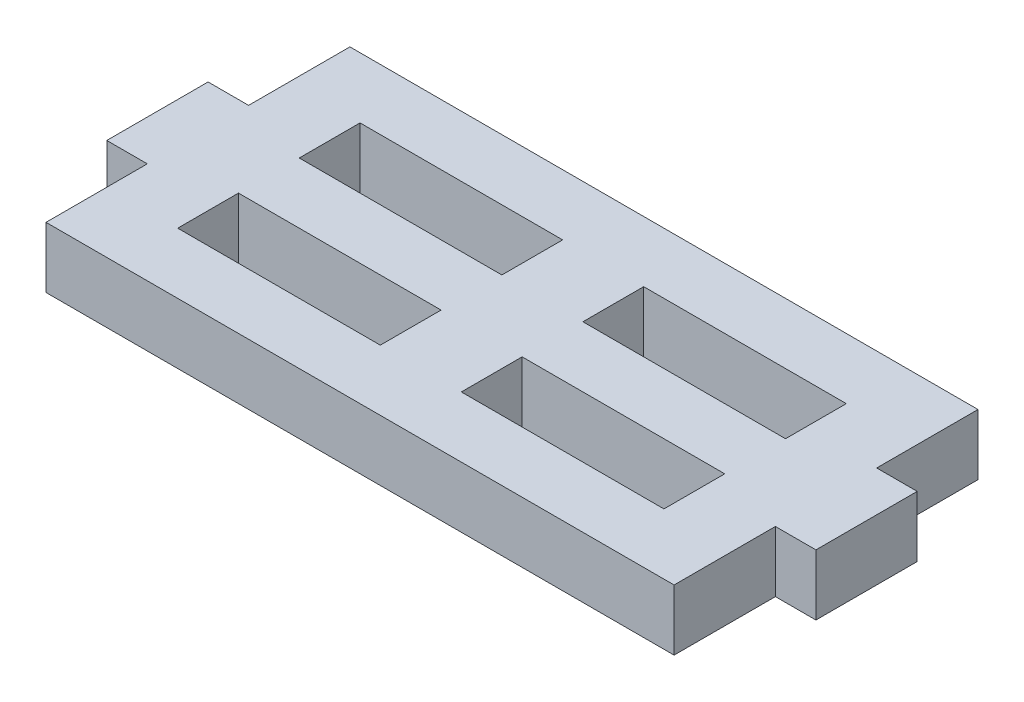
ISO-10303-21;
HEADER;
FILE_DESCRIPTION(('STEP AP214'),'2;1');
FILE_NAME('part.step','',(''),(''),'','','');
FILE_SCHEMA(('AUTOMOTIVE_DESIGN { 1 0 10303 214 1 1 1 1 }'));
ENDSEC;
DATA;
#1=APPLICATION_CONTEXT('core data for automotive mechanical design processes');
#2=APPLICATION_PROTOCOL_DEFINITION('international standard','automotive_design',2000,#1);
#3=PRODUCT_CONTEXT('',#1,'mechanical');
#4=PRODUCT('Part','Part','',(#3));
#5=PRODUCT_RELATED_PRODUCT_CATEGORY('part','',(#4));
#6=PRODUCT_DEFINITION_FORMATION('','',#4);
#7=PRODUCT_DEFINITION_CONTEXT('part definition',#1,'design');
#8=PRODUCT_DEFINITION('design','',#6,#7);
#9=PRODUCT_DEFINITION_SHAPE('','',#8);
#10=(LENGTH_UNIT() NAMED_UNIT(*) SI_UNIT(.MILLI.,.METRE.));
#11=(NAMED_UNIT(*) PLANE_ANGLE_UNIT() SI_UNIT($,.RADIAN.));
#12=(NAMED_UNIT(*) SI_UNIT($,.STERADIAN.) SOLID_ANGLE_UNIT());
#13=UNCERTAINTY_MEASURE_WITH_UNIT(LENGTH_MEASURE(1.E-05),#10,'distance_accuracy_value','');
#14=(GEOMETRIC_REPRESENTATION_CONTEXT(3) GLOBAL_UNCERTAINTY_ASSIGNED_CONTEXT((#13)) GLOBAL_UNIT_ASSIGNED_CONTEXT((#10,
#11,#12)) REPRESENTATION_CONTEXT('',''));
#15=CARTESIAN_POINT('',(0.,0.,0.));
#16=DIRECTION('',(0.,0.,1.));
#17=DIRECTION('',(1.,0.,0.));
#18=AXIS2_PLACEMENT_3D('',#15,#16,#17);
#19=CARTESIAN_POINT('',(-17.5,3.,7.5));
#20=DIRECTION('',(1.,0.,0.));
#21=DIRECTION('',(0.,0.,-1.));
#22=AXIS2_PLACEMENT_3D('',#19,#20,#21);
#23=PLANE('',#22);
#24=DIRECTION('',(0.,0.,1.));
#25=VECTOR('',#24,1.);
#26=CARTESIAN_POINT('',(-17.5,3.,7.5));
#27=LINE('',#26,#25);
#28=CARTESIAN_POINT('',(-17.5,3.,-2.5));
#29=VERTEX_POINT('',#28);
#30=CARTESIAN_POINT('',(-17.5,3.,2.5));
#31=VERTEX_POINT('',#30);
#32=EDGE_CURVE('E235',#29,#31,#27,.T.);
#33=ORIENTED_EDGE('',*,*,#32,.F.);
#34=DIRECTION('',(0.,1.,0.));
#35=VECTOR('',#34,1.);
#36=CARTESIAN_POINT('',(-17.5,0.,-2.5));
#37=LINE('',#36,#35);
#38=CARTESIAN_POINT('',(-17.5,0.,-2.5));
#39=VERTEX_POINT('',#38);
#40=EDGE_CURVE('E224',#39,#29,#37,.T.);
#41=ORIENTED_EDGE('',*,*,#40,.F.);
#42=DIRECTION('',(0.,0.,1.));
#43=VECTOR('',#42,1.);
#44=CARTESIAN_POINT('',(-17.5,0.,7.5));
#45=LINE('',#44,#43);
#46=CARTESIAN_POINT('',(-17.5,0.,2.5));
#47=VERTEX_POINT('',#46);
#48=EDGE_CURVE('E234',#39,#47,#45,.T.);
#49=ORIENTED_EDGE('',*,*,#48,.T.);
#50=DIRECTION('',(0.,1.,0.));
#51=VECTOR('',#50,1.);
#52=CARTESIAN_POINT('',(-17.5,0.,2.5));
#53=LINE('',#52,#51);
#54=EDGE_CURVE('E763',#47,#31,#53,.T.);
#55=ORIENTED_EDGE('',*,*,#54,.T.);
#56=EDGE_LOOP('',(#33,#41,#49,#55));
#57=FACE_BOUND('',#56,.T.);
#58=ADVANCED_FACE('F34',(#57),#23,.F.);
#59=CARTESIAN_POINT('',(17.5,3.,7.5));
#60=DIRECTION('',(0.,0.,-1.));
#61=DIRECTION('',(-1.,0.,0.));
#62=AXIS2_PLACEMENT_3D('',#59,#60,#61);
#63=PLANE('',#62);
#64=DIRECTION('',(1.,0.,0.));
#65=VECTOR('',#64,1.);
#66=CARTESIAN_POINT('',(17.5,3.,7.5));
#67=LINE('',#66,#65);
#68=CARTESIAN_POINT('',(-15.5,3.,7.5));
#69=VERTEX_POINT('',#68);
#70=CARTESIAN_POINT('',(15.5,3.,7.5));
#71=VERTEX_POINT('',#70);
#72=EDGE_CURVE('E257',#69,#71,#67,.T.);
#73=ORIENTED_EDGE('',*,*,#72,.F.);
#74=DIRECTION('',(0.,1.,0.));
#75=VECTOR('',#74,1.);
#76=CARTESIAN_POINT('',(-15.5,0.,7.5));
#77=LINE('',#76,#75);
#78=CARTESIAN_POINT('',(-15.5,0.,7.5));
#79=VERTEX_POINT('',#78);
#80=EDGE_CURVE('E768',#79,#69,#77,.T.);
#81=ORIENTED_EDGE('',*,*,#80,.F.);
#82=DIRECTION('',(1.,0.,0.));
#83=VECTOR('',#82,1.);
#84=CARTESIAN_POINT('',(17.5,0.,7.5));
#85=LINE('',#84,#83);
#86=CARTESIAN_POINT('',(15.5,0.,7.5));
#87=VERTEX_POINT('',#86);
#88=EDGE_CURVE('E239',#79,#87,#85,.T.);
#89=ORIENTED_EDGE('',*,*,#88,.T.);
#90=DIRECTION('',(0.,1.,0.));
#91=VECTOR('',#90,1.);
#92=CARTESIAN_POINT('',(15.5,0.,7.5));
#93=LINE('',#92,#91);
#94=EDGE_CURVE('E745',#87,#71,#93,.T.);
#95=ORIENTED_EDGE('',*,*,#94,.T.);
#96=EDGE_LOOP('',(#73,#81,#89,#95));
#97=FACE_BOUND('',#96,.T.);
#98=ADVANCED_FACE('F446',(#97),#63,.F.);
#99=CARTESIAN_POINT('',(17.5,3.,7.5));
#100=DIRECTION('',(-1.,0.,0.));
#101=DIRECTION('',(0.,0.,1.));
#102=AXIS2_PLACEMENT_3D('',#99,#100,#101);
#103=PLANE('',#102);
#104=DIRECTION('',(0.,0.,-1.));
#105=VECTOR('',#104,1.);
#106=CARTESIAN_POINT('',(17.5,3.,7.5));
#107=LINE('',#106,#105);
#108=CARTESIAN_POINT('',(17.5,3.,2.5));
#109=VERTEX_POINT('',#108);
#110=CARTESIAN_POINT('',(17.5,3.,-2.5));
#111=VERTEX_POINT('',#110);
#112=EDGE_CURVE('E42',#109,#111,#107,.T.);
#113=ORIENTED_EDGE('',*,*,#112,.F.);
#114=DIRECTION('',(0.,1.,0.));
#115=VECTOR('',#114,1.);
#116=CARTESIAN_POINT('',(17.5,0.,2.5));
#117=LINE('',#116,#115);
#118=CARTESIAN_POINT('',(17.5,0.,2.5));
#119=VERTEX_POINT('',#118);
#120=EDGE_CURVE('E754',#119,#109,#117,.T.);
#121=ORIENTED_EDGE('',*,*,#120,.F.);
#122=DIRECTION('',(0.,0.,-1.));
#123=VECTOR('',#122,1.);
#124=CARTESIAN_POINT('',(17.5,0.,7.5));
#125=LINE('',#124,#123);
#126=CARTESIAN_POINT('',(17.5,0.,-2.5));
#127=VERTEX_POINT('',#126);
#128=EDGE_CURVE('E242',#119,#127,#125,.T.);
#129=ORIENTED_EDGE('',*,*,#128,.T.);
#130=DIRECTION('',(0.,1.,0.));
#131=VECTOR('',#130,1.);
#132=CARTESIAN_POINT('',(17.5,0.,-2.5));
#133=LINE('',#132,#131);
#134=EDGE_CURVE('E281',#127,#111,#133,.T.);
#135=ORIENTED_EDGE('',*,*,#134,.T.);
#136=EDGE_LOOP('',(#113,#121,#129,#135));
#137=FACE_BOUND('',#136,.T.);
#138=ADVANCED_FACE('F288',(#137),#103,.F.);
#139=CARTESIAN_POINT('',(17.5,3.,-7.5));
#140=DIRECTION('',(0.,0.,1.));
#141=DIRECTION('',(1.,0.,0.));
#142=AXIS2_PLACEMENT_3D('',#139,#140,#141);
#143=PLANE('',#142);
#144=DIRECTION('',(-1.,0.,0.));
#145=VECTOR('',#144,1.);
#146=CARTESIAN_POINT('',(17.5,0.,-7.5));
#147=LINE('',#146,#145);
#148=CARTESIAN_POINT('',(15.5,0.,-7.5));
#149=VERTEX_POINT('',#148);
#150=CARTESIAN_POINT('',(-15.5,0.,-7.5));
#151=VERTEX_POINT('',#150);
#152=EDGE_CURVE('E37',#149,#151,#147,.T.);
#153=ORIENTED_EDGE('',*,*,#152,.T.);
#154=DIRECTION('',(0.,1.,0.));
#155=VECTOR('',#154,1.);
#156=CARTESIAN_POINT('',(-15.5,0.,-7.5));
#157=LINE('',#156,#155);
#158=CARTESIAN_POINT('',(-15.5,3.,-7.5));
#159=VERTEX_POINT('',#158);
#160=EDGE_CURVE('E739',#151,#159,#157,.T.);
#161=ORIENTED_EDGE('',*,*,#160,.T.);
#162=DIRECTION('',(-1.,0.,0.));
#163=VECTOR('',#162,1.);
#164=CARTESIAN_POINT('',(17.5,3.,-7.5));
#165=LINE('',#164,#163);
#166=CARTESIAN_POINT('',(15.5,3.,-7.5));
#167=VERTEX_POINT('',#166);
#168=EDGE_CURVE('E11',#167,#159,#165,.T.);
#169=ORIENTED_EDGE('',*,*,#168,.F.);
#170=DIRECTION('',(0.,1.,0.));
#171=VECTOR('',#170,1.);
#172=CARTESIAN_POINT('',(15.5,0.,-7.5));
#173=LINE('',#172,#171);
#174=EDGE_CURVE('E289',#149,#167,#173,.T.);
#175=ORIENTED_EDGE('',*,*,#174,.F.);
#176=EDGE_LOOP('',(#153,#161,#169,#175));
#177=FACE_BOUND('',#176,.T.);
#178=ADVANCED_FACE('F454',(#177),#143,.F.);
#179=CARTESIAN_POINT('',(0.,3.,0.));
#180=DIRECTION('',(0.,1.,0.));
#181=DIRECTION('',(0.,0.,1.));
#182=AXIS2_PLACEMENT_3D('',#179,#180,#181);
#183=PLANE('',#182);
#184=DIRECTION('',(0.,0.,-1.));
#185=VECTOR('',#184,1.);
#186=CARTESIAN_POINT('',(-15.5,3.,-2.5));
#187=LINE('',#186,#185);
#188=CARTESIAN_POINT('',(-15.5,3.,-2.5));
#189=VERTEX_POINT('',#188);
#190=EDGE_CURVE('E229',#189,#159,#187,.T.);
#191=ORIENTED_EDGE('',*,*,#190,.F.);
#192=DIRECTION('',(1.,0.,0.));
#193=VECTOR('',#192,1.);
#194=CARTESIAN_POINT('',(-17.5,3.,-2.5));
#195=LINE('',#194,#193);
#196=EDGE_CURVE('E740',#29,#189,#195,.T.);
#197=ORIENTED_EDGE('',*,*,#196,.F.);
#198=ORIENTED_EDGE('',*,*,#32,.T.);
#199=DIRECTION('',(-1.,0.,0.));
#200=VECTOR('',#199,1.);
#201=CARTESIAN_POINT('',(-17.5,3.,2.5));
#202=LINE('',#201,#200);
#203=CARTESIAN_POINT('',(-15.5,3.,2.5));
#204=VERTEX_POINT('',#203);
#205=EDGE_CURVE('E773',#204,#31,#202,.T.);
#206=ORIENTED_EDGE('',*,*,#205,.F.);
#207=DIRECTION('',(0.,0.,-1.));
#208=VECTOR('',#207,1.);
#209=CARTESIAN_POINT('',(-15.5,3.,2.5));
#210=LINE('',#209,#208);
#211=EDGE_CURVE('E743',#69,#204,#210,.T.);
#212=ORIENTED_EDGE('',*,*,#211,.F.);
#213=ORIENTED_EDGE('',*,*,#72,.T.);
#214=DIRECTION('',(0.,0.,1.));
#215=VECTOR('',#214,1.);
#216=CARTESIAN_POINT('',(15.5,3.,2.5));
#217=LINE('',#216,#215);
#218=CARTESIAN_POINT('',(15.5,3.,2.5));
#219=VERTEX_POINT('',#218);
#220=EDGE_CURVE('E758',#219,#71,#217,.T.);
#221=ORIENTED_EDGE('',*,*,#220,.F.);
#222=DIRECTION('',(-1.,0.,0.));
#223=VECTOR('',#222,1.);
#224=CARTESIAN_POINT('',(17.5,3.,2.5));
#225=LINE('',#224,#223);
#226=EDGE_CURVE('E277',#109,#219,#225,.T.);
#227=ORIENTED_EDGE('',*,*,#226,.F.);
#228=ORIENTED_EDGE('',*,*,#112,.T.);
#229=DIRECTION('',(1.,0.,0.));
#230=VECTOR('',#229,1.);
#231=CARTESIAN_POINT('',(17.5,3.,-2.5));
#232=LINE('',#231,#230);
#233=CARTESIAN_POINT('',(15.5,3.,-2.5));
#234=VERTEX_POINT('',#233);
#235=EDGE_CURVE('E274',#234,#111,#232,.T.);
#236=ORIENTED_EDGE('',*,*,#235,.F.);
#237=DIRECTION('',(0.,0.,1.));
#238=VECTOR('',#237,1.);
#239=CARTESIAN_POINT('',(15.5,3.,-2.5));
#240=LINE('',#239,#238);
#241=EDGE_CURVE('E286',#167,#234,#240,.T.);
#242=ORIENTED_EDGE('',*,*,#241,.F.);
#243=ORIENTED_EDGE('',*,*,#168,.T.);
#244=EDGE_LOOP('',(#191,#197,#198,#206,#212,#213,#221,#227,#228,#236,#242,#243));
#245=FACE_BOUND('',#244,.T.);
#246=DIRECTION('',(-1.,0.,0.));
#247=VECTOR('',#246,1.);
#248=CARTESIAN_POINT('',(12.,3.,-4.5));
#249=LINE('',#248,#247);
#250=CARTESIAN_POINT('',(12.,3.,-4.5));
#251=VERTEX_POINT('',#250);
#252=CARTESIAN_POINT('',(2.,3.,-4.5));
#253=VERTEX_POINT('',#252);
#254=EDGE_CURVE('E291',#251,#253,#249,.T.);
#255=ORIENTED_EDGE('',*,*,#254,.F.);
#256=DIRECTION('',(0.,0.,-1.));
#257=VECTOR('',#256,1.);
#258=CARTESIAN_POINT('',(12.,3.,-4.5));
#259=LINE('',#258,#257);
#260=CARTESIAN_POINT('',(12.,3.,-1.5));
#261=VERTEX_POINT('',#260);
#262=EDGE_CURVE('E300',#261,#251,#259,.T.);
#263=ORIENTED_EDGE('',*,*,#262,.F.);
#264=DIRECTION('',(1.,0.,0.));
#265=VECTOR('',#264,1.);
#266=CARTESIAN_POINT('',(12.,3.,-1.5));
#267=LINE('',#266,#265);
#268=CARTESIAN_POINT('',(2.,3.,-1.5));
#269=VERTEX_POINT('',#268);
#270=EDGE_CURVE('E314',#269,#261,#267,.T.);
#271=ORIENTED_EDGE('',*,*,#270,.F.);
#272=DIRECTION('',(0.,0.,1.));
#273=VECTOR('',#272,1.);
#274=CARTESIAN_POINT('',(2.,3.,-4.5));
#275=LINE('',#274,#273);
#276=EDGE_CURVE('E311',#253,#269,#275,.T.);
#277=ORIENTED_EDGE('',*,*,#276,.F.);
#278=EDGE_LOOP('',(#255,#263,#271,#277));
#279=FACE_BOUND('',#278,.T.);
#280=DIRECTION('',(1.,0.,0.));
#281=VECTOR('',#280,1.);
#282=CARTESIAN_POINT('',(12.,3.,4.5));
#283=LINE('',#282,#281);
#284=CARTESIAN_POINT('',(2.,3.,4.5));
#285=VERTEX_POINT('',#284);
#286=CARTESIAN_POINT('',(12.,3.,4.5));
#287=VERTEX_POINT('',#286);
#288=EDGE_CURVE('E321',#285,#287,#283,.T.);
#289=ORIENTED_EDGE('',*,*,#288,.F.);
#290=DIRECTION('',(0.,0.,1.));
#291=VECTOR('',#290,1.);
#292=CARTESIAN_POINT('',(2.,3.,4.5));
#293=LINE('',#292,#291);
#294=CARTESIAN_POINT('',(2.,3.,1.5));
#295=VERTEX_POINT('',#294);
#296=EDGE_CURVE('E332',#295,#285,#293,.T.);
#297=ORIENTED_EDGE('',*,*,#296,.F.);
#298=DIRECTION('',(-1.,0.,0.));
#299=VECTOR('',#298,1.);
#300=CARTESIAN_POINT('',(12.,3.,1.5));
#301=LINE('',#300,#299);
#302=CARTESIAN_POINT('',(12.,3.,1.5));
#303=VERTEX_POINT('',#302);
#304=EDGE_CURVE('E346',#303,#295,#301,.T.);
#305=ORIENTED_EDGE('',*,*,#304,.F.);
#306=DIRECTION('',(0.,0.,-1.));
#307=VECTOR('',#306,1.);
#308=CARTESIAN_POINT('',(12.,3.,4.5));
#309=LINE('',#308,#307);
#310=EDGE_CURVE('E343',#287,#303,#309,.T.);
#311=ORIENTED_EDGE('',*,*,#310,.F.);
#312=EDGE_LOOP('',(#289,#297,#305,#311));
#313=FACE_BOUND('',#312,.T.);
#314=DIRECTION('',(1.,0.,0.));
#315=VECTOR('',#314,1.);
#316=CARTESIAN_POINT('',(-12.,3.,4.5));
#317=LINE('',#316,#315);
#318=CARTESIAN_POINT('',(-12.,3.,4.5));
#319=VERTEX_POINT('',#318);
#320=CARTESIAN_POINT('',(-2.,3.,4.5));
#321=VERTEX_POINT('',#320);
#322=EDGE_CURVE('E353',#319,#321,#317,.T.);
#323=ORIENTED_EDGE('',*,*,#322,.F.);
#324=DIRECTION('',(0.,0.,1.));
#325=VECTOR('',#324,1.);
#326=CARTESIAN_POINT('',(-12.,3.,4.5));
#327=LINE('',#326,#325);
#328=CARTESIAN_POINT('',(-12.,3.,1.5));
#329=VERTEX_POINT('',#328);
#330=EDGE_CURVE('E364',#329,#319,#327,.T.);
#331=ORIENTED_EDGE('',*,*,#330,.F.);
#332=DIRECTION('',(-1.,0.,0.));
#333=VECTOR('',#332,1.);
#334=CARTESIAN_POINT('',(-12.,3.,1.5));
#335=LINE('',#334,#333);
#336=CARTESIAN_POINT('',(-2.,3.,1.5));
#337=VERTEX_POINT('',#336);
#338=EDGE_CURVE('E378',#337,#329,#335,.T.);
#339=ORIENTED_EDGE('',*,*,#338,.F.);
#340=DIRECTION('',(0.,0.,-1.));
#341=VECTOR('',#340,1.);
#342=CARTESIAN_POINT('',(-2.,3.,4.5));
#343=LINE('',#342,#341);
#344=EDGE_CURVE('E375',#321,#337,#343,.T.);
#345=ORIENTED_EDGE('',*,*,#344,.F.);
#346=EDGE_LOOP('',(#323,#331,#339,#345));
#347=FACE_BOUND('',#346,.T.);
#348=DIRECTION('',(0.,0.,-1.));
#349=VECTOR('',#348,1.);
#350=CARTESIAN_POINT('',(-2.,3.,-4.5));
#351=LINE('',#350,#349);
#352=CARTESIAN_POINT('',(-2.,3.,-1.5));
#353=VERTEX_POINT('',#352);
#354=CARTESIAN_POINT('',(-2.,3.,-4.5));
#355=VERTEX_POINT('',#354);
#356=EDGE_CURVE('E385',#353,#355,#351,.T.);
#357=ORIENTED_EDGE('',*,*,#356,.F.);
#358=DIRECTION('',(1.,0.,0.));
#359=VECTOR('',#358,1.);
#360=CARTESIAN_POINT('',(-12.,3.,-1.5));
#361=LINE('',#360,#359);
#362=CARTESIAN_POINT('',(-12.,3.,-1.5));
#363=VERTEX_POINT('',#362);
#364=EDGE_CURVE('E396',#363,#353,#361,.T.);
#365=ORIENTED_EDGE('',*,*,#364,.F.);
#366=DIRECTION('',(0.,0.,1.));
#367=VECTOR('',#366,1.);
#368=CARTESIAN_POINT('',(-12.,3.,-4.5));
#369=LINE('',#368,#367);
#370=CARTESIAN_POINT('',(-12.,3.,-4.5));
#371=VERTEX_POINT('',#370);
#372=EDGE_CURVE('E409',#371,#363,#369,.T.);
#373=ORIENTED_EDGE('',*,*,#372,.F.);
#374=DIRECTION('',(-1.,0.,0.));
#375=VECTOR('',#374,1.);
#376=CARTESIAN_POINT('',(-12.,3.,-4.5));
#377=LINE('',#376,#375);
#378=EDGE_CURVE('E406',#355,#371,#377,.T.);
#379=ORIENTED_EDGE('',*,*,#378,.F.);
#380=EDGE_LOOP('',(#357,#365,#373,#379));
#381=FACE_BOUND('',#380,.T.);
#382=ADVANCED_FACE('F271',(#245,#279,#313,#347,#381),#183,.T.);
#383=CARTESIAN_POINT('',(0.,0.,0.));
#384=DIRECTION('',(0.,1.,0.));
#385=DIRECTION('',(0.,0.,1.));
#386=AXIS2_PLACEMENT_3D('',#383,#384,#385);
#387=PLANE('',#386);
#388=DIRECTION('',(0.,0.,-1.));
#389=VECTOR('',#388,1.);
#390=CARTESIAN_POINT('',(12.,0.,-4.5));
#391=LINE('',#390,#389);
#392=CARTESIAN_POINT('',(12.,0.,-1.5));
#393=VERTEX_POINT('',#392);
#394=CARTESIAN_POINT('',(12.,0.,-4.5));
#395=VERTEX_POINT('',#394);
#396=EDGE_CURVE('E306',#393,#395,#391,.T.);
#397=ORIENTED_EDGE('',*,*,#396,.T.);
#398=DIRECTION('',(-1.,0.,0.));
#399=VECTOR('',#398,1.);
#400=CARTESIAN_POINT('',(12.,0.,-4.5));
#401=LINE('',#400,#399);
#402=CARTESIAN_POINT('',(2.,0.,-4.5));
#403=VERTEX_POINT('',#402);
#404=EDGE_CURVE('E296',#395,#403,#401,.T.);
#405=ORIENTED_EDGE('',*,*,#404,.T.);
#406=DIRECTION('',(0.,0.,1.));
#407=VECTOR('',#406,1.);
#408=CARTESIAN_POINT('',(2.,0.,-4.5));
#409=LINE('',#408,#407);
#410=CARTESIAN_POINT('',(2.,0.,-1.5));
#411=VERTEX_POINT('',#410);
#412=EDGE_CURVE('E299',#403,#411,#409,.T.);
#413=ORIENTED_EDGE('',*,*,#412,.T.);
#414=DIRECTION('',(1.,0.,0.));
#415=VECTOR('',#414,1.);
#416=CARTESIAN_POINT('',(12.,0.,-1.5));
#417=LINE('',#416,#415);
#418=EDGE_CURVE('E303',#411,#393,#417,.T.);
#419=ORIENTED_EDGE('',*,*,#418,.T.);
#420=EDGE_LOOP('',(#397,#405,#413,#419));
#421=FACE_BOUND('',#420,.T.);
#422=DIRECTION('',(0.,0.,1.));
#423=VECTOR('',#422,1.);
#424=CARTESIAN_POINT('',(2.,0.,4.5));
#425=LINE('',#424,#423);
#426=CARTESIAN_POINT('',(2.,0.,1.5));
#427=VERTEX_POINT('',#426);
#428=CARTESIAN_POINT('',(2.,0.,4.5));
#429=VERTEX_POINT('',#428);
#430=EDGE_CURVE('E338',#427,#429,#425,.T.);
#431=ORIENTED_EDGE('',*,*,#430,.T.);
#432=DIRECTION('',(1.,0.,0.));
#433=VECTOR('',#432,1.);
#434=CARTESIAN_POINT('',(12.,0.,4.5));
#435=LINE('',#434,#433);
#436=CARTESIAN_POINT('',(12.,0.,4.5));
#437=VERTEX_POINT('',#436);
#438=EDGE_CURVE('E328',#429,#437,#435,.T.);
#439=ORIENTED_EDGE('',*,*,#438,.T.);
#440=DIRECTION('',(0.,0.,-1.));
#441=VECTOR('',#440,1.);
#442=CARTESIAN_POINT('',(12.,0.,4.5));
#443=LINE('',#442,#441);
#444=CARTESIAN_POINT('',(12.,0.,1.5));
#445=VERTEX_POINT('',#444);
#446=EDGE_CURVE('E331',#437,#445,#443,.T.);
#447=ORIENTED_EDGE('',*,*,#446,.T.);
#448=DIRECTION('',(-1.,0.,0.));
#449=VECTOR('',#448,1.);
#450=CARTESIAN_POINT('',(12.,0.,1.5));
#451=LINE('',#450,#449);
#452=EDGE_CURVE('E335',#445,#427,#451,.T.);
#453=ORIENTED_EDGE('',*,*,#452,.T.);
#454=EDGE_LOOP('',(#431,#439,#447,#453));
#455=FACE_BOUND('',#454,.T.);
#456=DIRECTION('',(0.,0.,1.));
#457=VECTOR('',#456,1.);
#458=CARTESIAN_POINT('',(-12.,0.,4.5));
#459=LINE('',#458,#457);
#460=CARTESIAN_POINT('',(-12.,0.,1.5));
#461=VERTEX_POINT('',#460);
#462=CARTESIAN_POINT('',(-12.,0.,4.5));
#463=VERTEX_POINT('',#462);
#464=EDGE_CURVE('E370',#461,#463,#459,.T.);
#465=ORIENTED_EDGE('',*,*,#464,.T.);
#466=DIRECTION('',(1.,0.,0.));
#467=VECTOR('',#466,1.);
#468=CARTESIAN_POINT('',(-12.,0.,4.5));
#469=LINE('',#468,#467);
#470=CARTESIAN_POINT('',(-2.,0.,4.5));
#471=VERTEX_POINT('',#470);
#472=EDGE_CURVE('E360',#463,#471,#469,.T.);
#473=ORIENTED_EDGE('',*,*,#472,.T.);
#474=DIRECTION('',(0.,0.,-1.));
#475=VECTOR('',#474,1.);
#476=CARTESIAN_POINT('',(-2.,0.,4.5));
#477=LINE('',#476,#475);
#478=CARTESIAN_POINT('',(-2.,0.,1.5));
#479=VERTEX_POINT('',#478);
#480=EDGE_CURVE('E363',#471,#479,#477,.T.);
#481=ORIENTED_EDGE('',*,*,#480,.T.);
#482=DIRECTION('',(-1.,0.,0.));
#483=VECTOR('',#482,1.);
#484=CARTESIAN_POINT('',(-12.,0.,1.5));
#485=LINE('',#484,#483);
#486=EDGE_CURVE('E367',#479,#461,#485,.T.);
#487=ORIENTED_EDGE('',*,*,#486,.T.);
#488=EDGE_LOOP('',(#465,#473,#481,#487));
#489=FACE_BOUND('',#488,.T.);
#490=DIRECTION('',(1.,0.,0.));
#491=VECTOR('',#490,1.);
#492=CARTESIAN_POINT('',(-12.,0.,-1.5));
#493=LINE('',#492,#491);
#494=CARTESIAN_POINT('',(-12.,0.,-1.5));
#495=VERTEX_POINT('',#494);
#496=CARTESIAN_POINT('',(-2.,0.,-1.5));
#497=VERTEX_POINT('',#496);
#498=EDGE_CURVE('E402',#495,#497,#493,.T.);
#499=ORIENTED_EDGE('',*,*,#498,.T.);
#500=DIRECTION('',(0.,0.,-1.));
#501=VECTOR('',#500,1.);
#502=CARTESIAN_POINT('',(-2.,0.,-4.5));
#503=LINE('',#502,#501);
#504=CARTESIAN_POINT('',(-2.,0.,-4.5));
#505=VERTEX_POINT('',#504);
#506=EDGE_CURVE('E392',#497,#505,#503,.T.);
#507=ORIENTED_EDGE('',*,*,#506,.T.);
#508=DIRECTION('',(-1.,0.,0.));
#509=VECTOR('',#508,1.);
#510=CARTESIAN_POINT('',(-12.,0.,-4.5));
#511=LINE('',#510,#509);
#512=CARTESIAN_POINT('',(-12.,0.,-4.5));
#513=VERTEX_POINT('',#512);
#514=EDGE_CURVE('E395',#505,#513,#511,.T.);
#515=ORIENTED_EDGE('',*,*,#514,.T.);
#516=DIRECTION('',(0.,0.,1.));
#517=VECTOR('',#516,1.);
#518=CARTESIAN_POINT('',(-12.,0.,-4.5));
#519=LINE('',#518,#517);
#520=EDGE_CURVE('E399',#513,#495,#519,.T.);
#521=ORIENTED_EDGE('',*,*,#520,.T.);
#522=EDGE_LOOP('',(#499,#507,#515,#521));
#523=FACE_BOUND('',#522,.T.);
#524=DIRECTION('',(1.,0.,0.));
#525=VECTOR('',#524,1.);
#526=CARTESIAN_POINT('',(-17.5,0.,-2.5));
#527=LINE('',#526,#525);
#528=CARTESIAN_POINT('',(-15.5,0.,-2.5));
#529=VERTEX_POINT('',#528);
#530=EDGE_CURVE('E220',#39,#529,#527,.T.);
#531=ORIENTED_EDGE('',*,*,#530,.T.);
#532=DIRECTION('',(0.,0.,-1.));
#533=VECTOR('',#532,1.);
#534=CARTESIAN_POINT('',(-15.5,0.,-2.5));
#535=LINE('',#534,#533);
#536=EDGE_CURVE('E50',#529,#151,#535,.T.);
#537=ORIENTED_EDGE('',*,*,#536,.T.);
#538=ORIENTED_EDGE('',*,*,#152,.F.);
#539=DIRECTION('',(0.,0.,1.));
#540=VECTOR('',#539,1.);
#541=CARTESIAN_POINT('',(15.5,0.,-2.5));
#542=LINE('',#541,#540);
#543=CARTESIAN_POINT('',(15.5,0.,-2.5));
#544=VERTEX_POINT('',#543);
#545=EDGE_CURVE('E285',#149,#544,#542,.T.);
#546=ORIENTED_EDGE('',*,*,#545,.T.);
#547=DIRECTION('',(1.,0.,0.));
#548=VECTOR('',#547,1.);
#549=CARTESIAN_POINT('',(17.5,0.,-2.5));
#550=LINE('',#549,#548);
#551=EDGE_CURVE('E293',#544,#127,#550,.T.);
#552=ORIENTED_EDGE('',*,*,#551,.T.);
#553=ORIENTED_EDGE('',*,*,#128,.F.);
#554=DIRECTION('',(-1.,0.,0.));
#555=VECTOR('',#554,1.);
#556=CARTESIAN_POINT('',(17.5,0.,2.5));
#557=LINE('',#556,#555);
#558=CARTESIAN_POINT('',(15.5,0.,2.5));
#559=VERTEX_POINT('',#558);
#560=EDGE_CURVE('E761',#119,#559,#557,.T.);
#561=ORIENTED_EDGE('',*,*,#560,.T.);
#562=DIRECTION('',(0.,0.,1.));
#563=VECTOR('',#562,1.);
#564=CARTESIAN_POINT('',(15.5,0.,2.5));
#565=LINE('',#564,#563);
#566=EDGE_CURVE('E756',#559,#87,#565,.T.);
#567=ORIENTED_EDGE('',*,*,#566,.T.);
#568=ORIENTED_EDGE('',*,*,#88,.F.);
#569=DIRECTION('',(0.,0.,-1.));
#570=VECTOR('',#569,1.);
#571=CARTESIAN_POINT('',(-15.5,0.,2.5));
#572=LINE('',#571,#570);
#573=CARTESIAN_POINT('',(-15.5,0.,2.5));
#574=VERTEX_POINT('',#573);
#575=EDGE_CURVE('E775',#79,#574,#572,.T.);
#576=ORIENTED_EDGE('',*,*,#575,.T.);
#577=DIRECTION('',(-1.,0.,0.));
#578=VECTOR('',#577,1.);
#579=CARTESIAN_POINT('',(-17.5,0.,2.5));
#580=LINE('',#579,#578);
#581=EDGE_CURVE('E58',#574,#47,#580,.T.);
#582=ORIENTED_EDGE('',*,*,#581,.T.);
#583=ORIENTED_EDGE('',*,*,#48,.F.);
#584=EDGE_LOOP('',(#531,#537,#538,#546,#552,#553,#561,#567,#568,#576,#582,#583));
#585=FACE_BOUND('',#584,.T.);
#586=ADVANCED_FACE('F237',(#421,#455,#489,#523,#585),#387,.F.);
#587=CARTESIAN_POINT('',(-2.,0.,-4.5));
#588=DIRECTION('',(1.,0.,0.));
#589=DIRECTION('',(0.,0.,-1.));
#590=AXIS2_PLACEMENT_3D('',#587,#588,#589);
#591=PLANE('',#590);
#592=ORIENTED_EDGE('',*,*,#356,.T.);
#593=DIRECTION('',(0.,1.,0.));
#594=VECTOR('',#593,1.);
#595=CARTESIAN_POINT('',(-2.,0.,-4.5));
#596=LINE('',#595,#594);
#597=EDGE_CURVE('E264',#505,#355,#596,.T.);
#598=ORIENTED_EDGE('',*,*,#597,.F.);
#599=ORIENTED_EDGE('',*,*,#506,.F.);
#600=DIRECTION('',(0.,1.,0.));
#601=VECTOR('',#600,1.);
#602=CARTESIAN_POINT('',(-2.,0.,-1.5));
#603=LINE('',#602,#601);
#604=EDGE_CURVE('E240',#497,#353,#603,.T.);
#605=ORIENTED_EDGE('',*,*,#604,.T.);
#606=EDGE_LOOP('',(#592,#598,#599,#605));
#607=FACE_BOUND('',#606,.T.);
#608=ADVANCED_FACE('F433',(#607),#591,.F.);
#609=CARTESIAN_POINT('',(-12.,0.,-1.5));
#610=DIRECTION('',(0.,0.,1.));
#611=DIRECTION('',(1.,0.,0.));
#612=AXIS2_PLACEMENT_3D('',#609,#610,#611);
#613=PLANE('',#612);
#614=ORIENTED_EDGE('',*,*,#364,.T.);
#615=ORIENTED_EDGE('',*,*,#604,.F.);
#616=ORIENTED_EDGE('',*,*,#498,.F.);
#617=DIRECTION('',(0.,1.,0.));
#618=VECTOR('',#617,1.);
#619=CARTESIAN_POINT('',(-12.,0.,-1.5));
#620=LINE('',#619,#618);
#621=EDGE_CURVE('E244',#495,#363,#620,.T.);
#622=ORIENTED_EDGE('',*,*,#621,.T.);
#623=EDGE_LOOP('',(#614,#615,#616,#622));
#624=FACE_BOUND('',#623,.T.);
#625=ADVANCED_FACE('F431',(#624),#613,.F.);
#626=CARTESIAN_POINT('',(-12.,0.,-4.5));
#627=DIRECTION('',(-1.,0.,0.));
#628=DIRECTION('',(0.,0.,1.));
#629=AXIS2_PLACEMENT_3D('',#626,#627,#628);
#630=PLANE('',#629);
#631=ORIENTED_EDGE('',*,*,#372,.T.);
#632=ORIENTED_EDGE('',*,*,#621,.F.);
#633=ORIENTED_EDGE('',*,*,#520,.F.);
#634=DIRECTION('',(0.,1.,0.));
#635=VECTOR('',#634,1.);
#636=CARTESIAN_POINT('',(-12.,0.,-4.5));
#637=LINE('',#636,#635);
#638=EDGE_CURVE('E414',#513,#371,#637,.T.);
#639=ORIENTED_EDGE('',*,*,#638,.T.);
#640=EDGE_LOOP('',(#631,#632,#633,#639));
#641=FACE_BOUND('',#640,.T.);
#642=ADVANCED_FACE('F428',(#641),#630,.F.);
#643=CARTESIAN_POINT('',(-12.,0.,-4.5));
#644=DIRECTION('',(0.,0.,-1.));
#645=DIRECTION('',(-1.,0.,0.));
#646=AXIS2_PLACEMENT_3D('',#643,#644,#645);
#647=PLANE('',#646);
#648=ORIENTED_EDGE('',*,*,#378,.T.);
#649=ORIENTED_EDGE('',*,*,#638,.F.);
#650=ORIENTED_EDGE('',*,*,#514,.F.);
#651=ORIENTED_EDGE('',*,*,#597,.T.);
#652=EDGE_LOOP('',(#648,#649,#650,#651));
#653=FACE_BOUND('',#652,.T.);
#654=ADVANCED_FACE('F421',(#653),#647,.F.);
#655=CARTESIAN_POINT('',(-12.,0.,4.5));
#656=DIRECTION('',(0.,0.,1.));
#657=DIRECTION('',(1.,0.,0.));
#658=AXIS2_PLACEMENT_3D('',#655,#656,#657);
#659=PLANE('',#658);
#660=ORIENTED_EDGE('',*,*,#322,.T.);
#661=DIRECTION('',(0.,1.,0.));
#662=VECTOR('',#661,1.);
#663=CARTESIAN_POINT('',(-2.,0.,4.5));
#664=LINE('',#663,#662);
#665=EDGE_CURVE('E373',#471,#321,#664,.T.);
#666=ORIENTED_EDGE('',*,*,#665,.F.);
#667=ORIENTED_EDGE('',*,*,#472,.F.);
#668=DIRECTION('',(0.,1.,0.));
#669=VECTOR('',#668,1.);
#670=CARTESIAN_POINT('',(-12.,0.,4.5));
#671=LINE('',#670,#669);
#672=EDGE_CURVE('E383',#463,#319,#671,.T.);
#673=ORIENTED_EDGE('',*,*,#672,.T.);
#674=EDGE_LOOP('',(#660,#666,#667,#673));
#675=FACE_BOUND('',#674,.T.);
#676=ADVANCED_FACE('F586',(#675),#659,.F.);
#677=CARTESIAN_POINT('',(-12.,0.,4.5));
#678=DIRECTION('',(-1.,0.,0.));
#679=DIRECTION('',(0.,0.,1.));
#680=AXIS2_PLACEMENT_3D('',#677,#678,#679);
#681=PLANE('',#680);
#682=ORIENTED_EDGE('',*,*,#330,.T.);
#683=ORIENTED_EDGE('',*,*,#672,.F.);
#684=ORIENTED_EDGE('',*,*,#464,.F.);
#685=DIRECTION('',(0.,1.,0.));
#686=VECTOR('',#685,1.);
#687=CARTESIAN_POINT('',(-12.,0.,1.5));
#688=LINE('',#687,#686);
#689=EDGE_CURVE('E386',#461,#329,#688,.T.);
#690=ORIENTED_EDGE('',*,*,#689,.T.);
#691=EDGE_LOOP('',(#682,#683,#684,#690));
#692=FACE_BOUND('',#691,.T.);
#693=ADVANCED_FACE('F582',(#692),#681,.F.);
#694=CARTESIAN_POINT('',(-12.,0.,1.5));
#695=DIRECTION('',(0.,0.,-1.));
#696=DIRECTION('',(-1.,0.,0.));
#697=AXIS2_PLACEMENT_3D('',#694,#695,#696);
#698=PLANE('',#697);
#699=ORIENTED_EDGE('',*,*,#338,.T.);
#700=ORIENTED_EDGE('',*,*,#689,.F.);
#701=ORIENTED_EDGE('',*,*,#486,.F.);
#702=DIRECTION('',(0.,1.,0.));
#703=VECTOR('',#702,1.);
#704=CARTESIAN_POINT('',(-2.,0.,1.5));
#705=LINE('',#704,#703);
#706=EDGE_CURVE('E388',#479,#337,#705,.T.);
#707=ORIENTED_EDGE('',*,*,#706,.T.);
#708=EDGE_LOOP('',(#699,#700,#701,#707));
#709=FACE_BOUND('',#708,.T.);
#710=ADVANCED_FACE('F585',(#709),#698,.F.);
#711=CARTESIAN_POINT('',(-2.,0.,4.5));
#712=DIRECTION('',(1.,0.,0.));
#713=DIRECTION('',(0.,0.,-1.));
#714=AXIS2_PLACEMENT_3D('',#711,#712,#713);
#715=PLANE('',#714);
#716=ORIENTED_EDGE('',*,*,#344,.T.);
#717=ORIENTED_EDGE('',*,*,#706,.F.);
#718=ORIENTED_EDGE('',*,*,#480,.F.);
#719=ORIENTED_EDGE('',*,*,#665,.T.);
#720=EDGE_LOOP('',(#716,#717,#718,#719));
#721=FACE_BOUND('',#720,.T.);
#722=ADVANCED_FACE('F580',(#721),#715,.F.);
#723=CARTESIAN_POINT('',(12.,0.,4.5));
#724=DIRECTION('',(0.,0.,1.));
#725=DIRECTION('',(1.,0.,0.));
#726=AXIS2_PLACEMENT_3D('',#723,#724,#725);
#727=PLANE('',#726);
#728=ORIENTED_EDGE('',*,*,#288,.T.);
#729=DIRECTION('',(0.,1.,0.));
#730=VECTOR('',#729,1.);
#731=CARTESIAN_POINT('',(12.,0.,4.5));
#732=LINE('',#731,#730);
#733=EDGE_CURVE('E341',#437,#287,#732,.T.);
#734=ORIENTED_EDGE('',*,*,#733,.F.);
#735=ORIENTED_EDGE('',*,*,#438,.F.);
#736=DIRECTION('',(0.,1.,0.));
#737=VECTOR('',#736,1.);
#738=CARTESIAN_POINT('',(2.,0.,4.5));
#739=LINE('',#738,#737);
#740=EDGE_CURVE('E351',#429,#285,#739,.T.);
#741=ORIENTED_EDGE('',*,*,#740,.T.);
#742=EDGE_LOOP('',(#728,#734,#735,#741));
#743=FACE_BOUND('',#742,.T.);
#744=ADVANCED_FACE('F570',(#743),#727,.F.);
#745=CARTESIAN_POINT('',(2.,0.,4.5));
#746=DIRECTION('',(-1.,0.,0.));
#747=DIRECTION('',(0.,0.,1.));
#748=AXIS2_PLACEMENT_3D('',#745,#746,#747);
#749=PLANE('',#748);
#750=ORIENTED_EDGE('',*,*,#296,.T.);
#751=ORIENTED_EDGE('',*,*,#740,.F.);
#752=ORIENTED_EDGE('',*,*,#430,.F.);
#753=DIRECTION('',(0.,1.,0.));
#754=VECTOR('',#753,1.);
#755=CARTESIAN_POINT('',(2.,0.,1.5));
#756=LINE('',#755,#754);
#757=EDGE_CURVE('E354',#427,#295,#756,.T.);
#758=ORIENTED_EDGE('',*,*,#757,.T.);
#759=EDGE_LOOP('',(#750,#751,#752,#758));
#760=FACE_BOUND('',#759,.T.);
#761=ADVANCED_FACE('F566',(#760),#749,.F.);
#762=CARTESIAN_POINT('',(12.,0.,1.5));
#763=DIRECTION('',(0.,0.,-1.));
#764=DIRECTION('',(-1.,0.,0.));
#765=AXIS2_PLACEMENT_3D('',#762,#763,#764);
#766=PLANE('',#765);
#767=ORIENTED_EDGE('',*,*,#304,.T.);
#768=ORIENTED_EDGE('',*,*,#757,.F.);
#769=ORIENTED_EDGE('',*,*,#452,.F.);
#770=DIRECTION('',(0.,1.,0.));
#771=VECTOR('',#770,1.);
#772=CARTESIAN_POINT('',(12.,0.,1.5));
#773=LINE('',#772,#771);
#774=EDGE_CURVE('E356',#445,#303,#773,.T.);
#775=ORIENTED_EDGE('',*,*,#774,.T.);
#776=EDGE_LOOP('',(#767,#768,#769,#775));
#777=FACE_BOUND('',#776,.T.);
#778=ADVANCED_FACE('F569',(#777),#766,.F.);
#779=CARTESIAN_POINT('',(12.,0.,4.5));
#780=DIRECTION('',(1.,0.,0.));
#781=DIRECTION('',(0.,0.,-1.));
#782=AXIS2_PLACEMENT_3D('',#779,#780,#781);
#783=PLANE('',#782);
#784=ORIENTED_EDGE('',*,*,#310,.T.);
#785=ORIENTED_EDGE('',*,*,#774,.F.);
#786=ORIENTED_EDGE('',*,*,#446,.F.);
#787=ORIENTED_EDGE('',*,*,#733,.T.);
#788=EDGE_LOOP('',(#784,#785,#786,#787));
#789=FACE_BOUND('',#788,.T.);
#790=ADVANCED_FACE('F564',(#789),#783,.F.);
#791=CARTESIAN_POINT('',(12.,0.,-4.5));
#792=DIRECTION('',(0.,0.,-1.));
#793=DIRECTION('',(-1.,0.,0.));
#794=AXIS2_PLACEMENT_3D('',#791,#792,#793);
#795=PLANE('',#794);
#796=ORIENTED_EDGE('',*,*,#254,.T.);
#797=DIRECTION('',(0.,1.,0.));
#798=VECTOR('',#797,1.);
#799=CARTESIAN_POINT('',(2.,0.,-4.5));
#800=LINE('',#799,#798);
#801=EDGE_CURVE('E309',#403,#253,#800,.T.);
#802=ORIENTED_EDGE('',*,*,#801,.F.);
#803=ORIENTED_EDGE('',*,*,#404,.F.);
#804=DIRECTION('',(0.,1.,0.));
#805=VECTOR('',#804,1.);
#806=CARTESIAN_POINT('',(12.,0.,-4.5));
#807=LINE('',#806,#805);
#808=EDGE_CURVE('E319',#395,#251,#807,.T.);
#809=ORIENTED_EDGE('',*,*,#808,.T.);
#810=EDGE_LOOP('',(#796,#802,#803,#809));
#811=FACE_BOUND('',#810,.T.);
#812=ADVANCED_FACE('F555',(#811),#795,.F.);
#813=CARTESIAN_POINT('',(12.,0.,-4.5));
#814=DIRECTION('',(1.,0.,0.));
#815=DIRECTION('',(0.,0.,-1.));
#816=AXIS2_PLACEMENT_3D('',#813,#814,#815);
#817=PLANE('',#816);
#818=ORIENTED_EDGE('',*,*,#262,.T.);
#819=ORIENTED_EDGE('',*,*,#808,.F.);
#820=ORIENTED_EDGE('',*,*,#396,.F.);
#821=DIRECTION('',(0.,1.,0.));
#822=VECTOR('',#821,1.);
#823=CARTESIAN_POINT('',(12.,0.,-1.5));
#824=LINE('',#823,#822);
#825=EDGE_CURVE('E322',#393,#261,#824,.T.);
#826=ORIENTED_EDGE('',*,*,#825,.T.);
#827=EDGE_LOOP('',(#818,#819,#820,#826));
#828=FACE_BOUND('',#827,.T.);
#829=ADVANCED_FACE('F551',(#828),#817,.F.);
#830=CARTESIAN_POINT('',(12.,0.,-1.5));
#831=DIRECTION('',(0.,0.,1.));
#832=DIRECTION('',(1.,0.,0.));
#833=AXIS2_PLACEMENT_3D('',#830,#831,#832);
#834=PLANE('',#833);
#835=ORIENTED_EDGE('',*,*,#270,.T.);
#836=ORIENTED_EDGE('',*,*,#825,.F.);
#837=ORIENTED_EDGE('',*,*,#418,.F.);
#838=DIRECTION('',(0.,1.,0.));
#839=VECTOR('',#838,1.);
#840=CARTESIAN_POINT('',(2.,0.,-1.5));
#841=LINE('',#840,#839);
#842=EDGE_CURVE('E324',#411,#269,#841,.T.);
#843=ORIENTED_EDGE('',*,*,#842,.T.);
#844=EDGE_LOOP('',(#835,#836,#837,#843));
#845=FACE_BOUND('',#844,.T.);
#846=ADVANCED_FACE('F554',(#845),#834,.F.);
#847=CARTESIAN_POINT('',(2.,0.,-4.5));
#848=DIRECTION('',(-1.,0.,0.));
#849=DIRECTION('',(0.,0.,1.));
#850=AXIS2_PLACEMENT_3D('',#847,#848,#849);
#851=PLANE('',#850);
#852=ORIENTED_EDGE('',*,*,#276,.T.);
#853=ORIENTED_EDGE('',*,*,#842,.F.);
#854=ORIENTED_EDGE('',*,*,#412,.F.);
#855=ORIENTED_EDGE('',*,*,#801,.T.);
#856=EDGE_LOOP('',(#852,#853,#854,#855));
#857=FACE_BOUND('',#856,.T.);
#858=ADVANCED_FACE('F479',(#857),#851,.F.);
#859=CARTESIAN_POINT('',(15.5,0.,-2.5));
#860=DIRECTION('',(-1.,0.,0.));
#861=DIRECTION('',(0.,0.,1.));
#862=AXIS2_PLACEMENT_3D('',#859,#860,#861);
#863=PLANE('',#862);
#864=ORIENTED_EDGE('',*,*,#241,.T.);
#865=DIRECTION('',(0.,1.,0.));
#866=VECTOR('',#865,1.);
#867=CARTESIAN_POINT('',(15.5,0.,-2.5));
#868=LINE('',#867,#866);
#869=EDGE_CURVE('E283',#544,#234,#868,.T.);
#870=ORIENTED_EDGE('',*,*,#869,.F.);
#871=ORIENTED_EDGE('',*,*,#545,.F.);
#872=ORIENTED_EDGE('',*,*,#174,.T.);
#873=EDGE_LOOP('',(#864,#870,#871,#872));
#874=FACE_BOUND('',#873,.T.);
#875=ADVANCED_FACE('F474',(#874),#863,.F.);
#876=CARTESIAN_POINT('',(17.5,0.,-2.5));
#877=DIRECTION('',(0.,0.,1.));
#878=DIRECTION('',(1.,0.,0.));
#879=AXIS2_PLACEMENT_3D('',#876,#877,#878);
#880=PLANE('',#879);
#881=ORIENTED_EDGE('',*,*,#235,.T.);
#882=ORIENTED_EDGE('',*,*,#134,.F.);
#883=ORIENTED_EDGE('',*,*,#551,.F.);
#884=ORIENTED_EDGE('',*,*,#869,.T.);
#885=EDGE_LOOP('',(#881,#882,#883,#884));
#886=FACE_BOUND('',#885,.T.);
#887=ADVANCED_FACE('F279',(#886),#880,.F.);
#888=CARTESIAN_POINT('',(15.5,0.,2.5));
#889=DIRECTION('',(-1.,0.,0.));
#890=DIRECTION('',(0.,0.,1.));
#891=AXIS2_PLACEMENT_3D('',#888,#889,#890);
#892=PLANE('',#891);
#893=ORIENTED_EDGE('',*,*,#220,.T.);
#894=ORIENTED_EDGE('',*,*,#94,.F.);
#895=ORIENTED_EDGE('',*,*,#566,.F.);
#896=DIRECTION('',(0.,1.,0.));
#897=VECTOR('',#896,1.);
#898=CARTESIAN_POINT('',(15.5,0.,2.5));
#899=LINE('',#898,#897);
#900=EDGE_CURVE('E748',#559,#219,#899,.T.);
#901=ORIENTED_EDGE('',*,*,#900,.T.);
#902=EDGE_LOOP('',(#893,#894,#895,#901));
#903=FACE_BOUND('',#902,.T.);
#904=ADVANCED_FACE('F491',(#903),#892,.F.);
#905=CARTESIAN_POINT('',(17.5,0.,2.5));
#906=DIRECTION('',(0.,0.,-1.));
#907=DIRECTION('',(-1.,0.,0.));
#908=AXIS2_PLACEMENT_3D('',#905,#906,#907);
#909=PLANE('',#908);
#910=ORIENTED_EDGE('',*,*,#226,.T.);
#911=ORIENTED_EDGE('',*,*,#900,.F.);
#912=ORIENTED_EDGE('',*,*,#560,.F.);
#913=ORIENTED_EDGE('',*,*,#120,.T.);
#914=EDGE_LOOP('',(#910,#911,#912,#913));
#915=FACE_BOUND('',#914,.T.);
#916=ADVANCED_FACE('F500',(#915),#909,.F.);
#917=CARTESIAN_POINT('',(-17.5,0.,2.5));
#918=DIRECTION('',(0.,0.,-1.));
#919=DIRECTION('',(-1.,0.,0.));
#920=AXIS2_PLACEMENT_3D('',#917,#918,#919);
#921=PLANE('',#920);
#922=ORIENTED_EDGE('',*,*,#205,.T.);
#923=ORIENTED_EDGE('',*,*,#54,.F.);
#924=ORIENTED_EDGE('',*,*,#581,.F.);
#925=DIRECTION('',(0.,1.,0.));
#926=VECTOR('',#925,1.);
#927=CARTESIAN_POINT('',(-15.5,0.,2.5));
#928=LINE('',#927,#926);
#929=EDGE_CURVE('E770',#574,#204,#928,.T.);
#930=ORIENTED_EDGE('',*,*,#929,.T.);
#931=EDGE_LOOP('',(#922,#923,#924,#930));
#932=FACE_BOUND('',#931,.T.);
#933=ADVANCED_FACE('F510',(#932),#921,.F.);
#934=CARTESIAN_POINT('',(-15.5,0.,2.5));
#935=DIRECTION('',(1.,0.,0.));
#936=DIRECTION('',(0.,0.,-1.));
#937=AXIS2_PLACEMENT_3D('',#934,#935,#936);
#938=PLANE('',#937);
#939=ORIENTED_EDGE('',*,*,#211,.T.);
#940=ORIENTED_EDGE('',*,*,#929,.F.);
#941=ORIENTED_EDGE('',*,*,#575,.F.);
#942=ORIENTED_EDGE('',*,*,#80,.T.);
#943=EDGE_LOOP('',(#939,#940,#941,#942));
#944=FACE_BOUND('',#943,.T.);
#945=ADVANCED_FACE('F520',(#944),#938,.F.);
#946=CARTESIAN_POINT('',(-15.5,0.,-2.5));
#947=DIRECTION('',(1.,0.,0.));
#948=DIRECTION('',(0.,0.,-1.));
#949=AXIS2_PLACEMENT_3D('',#946,#947,#948);
#950=PLANE('',#949);
#951=ORIENTED_EDGE('',*,*,#190,.T.);
#952=ORIENTED_EDGE('',*,*,#160,.F.);
#953=ORIENTED_EDGE('',*,*,#536,.F.);
#954=DIRECTION('',(0.,1.,0.));
#955=VECTOR('',#954,1.);
#956=CARTESIAN_POINT('',(-15.5,0.,-2.5));
#957=LINE('',#956,#955);
#958=EDGE_CURVE('E226',#529,#189,#957,.T.);
#959=ORIENTED_EDGE('',*,*,#958,.T.);
#960=EDGE_LOOP('',(#951,#952,#953,#959));
#961=FACE_BOUND('',#960,.T.);
#962=ADVANCED_FACE('F529',(#961),#950,.F.);
#963=CARTESIAN_POINT('',(-17.5,0.,-2.5));
#964=DIRECTION('',(0.,0.,1.));
#965=DIRECTION('',(1.,0.,0.));
#966=AXIS2_PLACEMENT_3D('',#963,#964,#965);
#967=PLANE('',#966);
#968=ORIENTED_EDGE('',*,*,#196,.T.);
#969=ORIENTED_EDGE('',*,*,#958,.F.);
#970=ORIENTED_EDGE('',*,*,#530,.F.);
#971=ORIENTED_EDGE('',*,*,#40,.T.);
#972=EDGE_LOOP('',(#968,#969,#970,#971));
#973=FACE_BOUND('',#972,.T.);
#974=ADVANCED_FACE('F223',(#973),#967,.F.);
#975=CLOSED_SHELL('',(#58,#98,#138,#178,#382,#586,#608,#625,#642,#654,#676,#693,#710,#722,#744,
#761,#778,#790,#812,#829,#846,#858,#875,#887,#904,#916,#933,#945,#962,#974));
#976=MANIFOLD_SOLID_BREP('B2',#975);
#977=ADVANCED_BREP_SHAPE_REPRESENTATION('',(#18,#976),#14);
#978=SHAPE_DEFINITION_REPRESENTATION(#9,#977);
ENDSEC;
END-ISO-10303-21;
